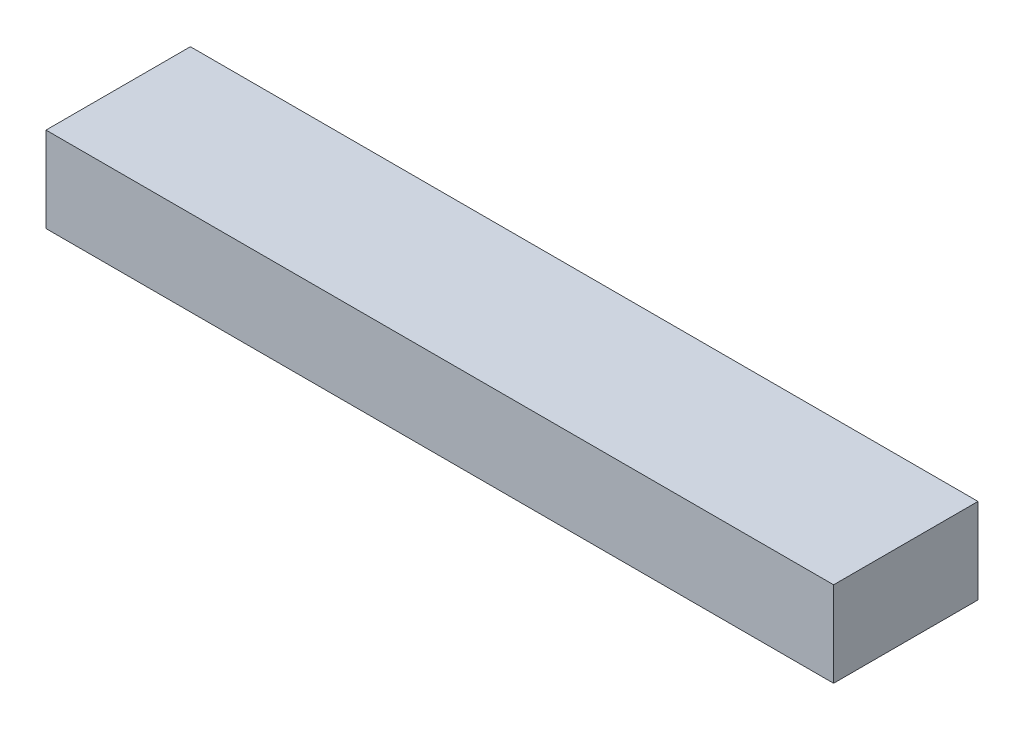
ISO-10303-21;
HEADER;
FILE_DESCRIPTION(('STEP AP214'),'2;1');
FILE_NAME('part.step','',(''),(''),'','','');
FILE_SCHEMA(('AUTOMOTIVE_DESIGN { 1 0 10303 214 1 1 1 1 }'));
ENDSEC;
DATA;
#1=APPLICATION_CONTEXT('core data for automotive mechanical design processes');
#2=APPLICATION_PROTOCOL_DEFINITION('international standard','automotive_design',2000,#1);
#3=PRODUCT_CONTEXT('',#1,'mechanical');
#4=PRODUCT('Part','Part','',(#3));
#5=PRODUCT_RELATED_PRODUCT_CATEGORY('part','',(#4));
#6=PRODUCT_DEFINITION_FORMATION('','',#4);
#7=PRODUCT_DEFINITION_CONTEXT('part definition',#1,'design');
#8=PRODUCT_DEFINITION('design','',#6,#7);
#9=PRODUCT_DEFINITION_SHAPE('','',#8);
#10=(LENGTH_UNIT() NAMED_UNIT(*) SI_UNIT(.MILLI.,.METRE.));
#11=(NAMED_UNIT(*) PLANE_ANGLE_UNIT() SI_UNIT($,.RADIAN.));
#12=(NAMED_UNIT(*) SI_UNIT($,.STERADIAN.) SOLID_ANGLE_UNIT());
#13=UNCERTAINTY_MEASURE_WITH_UNIT(LENGTH_MEASURE(1.E-05),#10,'distance_accuracy_value','');
#14=(GEOMETRIC_REPRESENTATION_CONTEXT(3) GLOBAL_UNCERTAINTY_ASSIGNED_CONTEXT((#13)) GLOBAL_UNIT_ASSIGNED_CONTEXT((#10,
#11,#12)) REPRESENTATION_CONTEXT('',''));
#15=CARTESIAN_POINT('',(0.,0.,0.));
#16=DIRECTION('',(0.,0.,1.));
#17=DIRECTION('',(1.,0.,0.));
#18=AXIS2_PLACEMENT_3D('',#15,#16,#17);
#19=CARTESIAN_POINT('',(-58.0824742268041,13.,-33.1134020618557));
#20=DIRECTION('',(1.,0.,0.));
#21=DIRECTION('',(0.,0.,-1.));
#22=AXIS2_PLACEMENT_3D('',#19,#20,#21);
#23=PLANE('',#22);
#24=DIRECTION('',(0.,0.,1.));
#25=VECTOR('',#24,1.);
#26=CARTESIAN_POINT('',(-58.0824742268041,0.,-33.1134020618557));
#27=LINE('',#26,#25);
#28=CARTESIAN_POINT('',(-58.0824742268041,0.,-33.1134020618557));
#29=VERTEX_POINT('',#28);
#30=CARTESIAN_POINT('',(-58.0824742268041,0.,-11.1134020618557));
#31=VERTEX_POINT('',#30);
#32=EDGE_CURVE('E97',#29,#31,#27,.T.);
#33=ORIENTED_EDGE('',*,*,#32,.T.);
#34=DIRECTION('',(0.,-1.,0.));
#35=VECTOR('',#34,1.);
#36=CARTESIAN_POINT('',(-58.0824742268041,13.,-11.1134020618557));
#37=LINE('',#36,#35);
#38=CARTESIAN_POINT('',(-58.0824742268041,13.,-11.1134020618557));
#39=VERTEX_POINT('',#38);
#40=EDGE_CURVE('E11',#39,#31,#37,.T.);
#41=ORIENTED_EDGE('',*,*,#40,.F.);
#42=DIRECTION('',(0.,0.,1.));
#43=VECTOR('',#42,1.);
#44=CARTESIAN_POINT('',(-58.0824742268041,13.,-33.1134020618557));
#45=LINE('',#44,#43);
#46=CARTESIAN_POINT('',(-58.0824742268041,13.,-33.1134020618557));
#47=VERTEX_POINT('',#46);
#48=EDGE_CURVE('E83',#47,#39,#45,.T.);
#49=ORIENTED_EDGE('',*,*,#48,.F.);
#50=DIRECTION('',(0.,-1.,0.));
#51=VECTOR('',#50,1.);
#52=CARTESIAN_POINT('',(-58.0824742268041,13.,-33.1134020618557));
#53=LINE('',#52,#51);
#54=EDGE_CURVE('E50',#47,#29,#53,.T.);
#55=ORIENTED_EDGE('',*,*,#54,.T.);
#56=EDGE_LOOP('',(#33,#41,#49,#55));
#57=FACE_BOUND('',#56,.T.);
#58=ADVANCED_FACE('F34',(#57),#23,.F.);
#59=CARTESIAN_POINT('',(-58.0824742268041,13.,-11.1134020618557));
#60=DIRECTION('',(0.,0.,-1.));
#61=DIRECTION('',(-1.,0.,0.));
#62=AXIS2_PLACEMENT_3D('',#59,#60,#61);
#63=PLANE('',#62);
#64=DIRECTION('',(1.,0.,0.));
#65=VECTOR('',#64,1.);
#66=CARTESIAN_POINT('',(-58.0824742268041,0.,-11.1134020618557));
#67=LINE('',#66,#65);
#68=CARTESIAN_POINT('',(61.9175257731959,0.,-11.1134020618557));
#69=VERTEX_POINT('',#68);
#70=EDGE_CURVE('E88',#31,#69,#67,.T.);
#71=ORIENTED_EDGE('',*,*,#70,.T.);
#72=DIRECTION('',(0.,-1.,0.));
#73=VECTOR('',#72,1.);
#74=CARTESIAN_POINT('',(61.9175257731959,13.,-11.1134020618557));
#75=LINE('',#74,#73);
#76=CARTESIAN_POINT('',(61.9175257731959,13.,-11.1134020618557));
#77=VERTEX_POINT('',#76);
#78=EDGE_CURVE('E42',#77,#69,#75,.T.);
#79=ORIENTED_EDGE('',*,*,#78,.F.);
#80=DIRECTION('',(1.,0.,0.));
#81=VECTOR('',#80,1.);
#82=CARTESIAN_POINT('',(-58.0824742268041,13.,-11.1134020618557));
#83=LINE('',#82,#81);
#84=EDGE_CURVE('E75',#39,#77,#83,.T.);
#85=ORIENTED_EDGE('',*,*,#84,.F.);
#86=ORIENTED_EDGE('',*,*,#40,.T.);
#87=EDGE_LOOP('',(#71,#79,#85,#86));
#88=FACE_BOUND('',#87,.T.);
#89=ADVANCED_FACE('F87',(#88),#63,.F.);
#90=CARTESIAN_POINT('',(61.9175257731959,13.,-33.1134020618557));
#91=DIRECTION('',(1.,0.,0.));
#92=DIRECTION('',(0.,0.,-1.));
#93=AXIS2_PLACEMENT_3D('',#90,#91,#92);
#94=PLANE('',#93);
#95=DIRECTION('',(0.,0.,1.));
#96=VECTOR('',#95,1.);
#97=CARTESIAN_POINT('',(61.9175257731959,0.,-33.1134020618557));
#98=LINE('',#97,#96);
#99=CARTESIAN_POINT('',(61.9175257731959,0.,-33.1134020618557));
#100=VERTEX_POINT('',#99);
#101=EDGE_CURVE('E100',#100,#69,#98,.T.);
#102=ORIENTED_EDGE('',*,*,#101,.F.);
#103=DIRECTION('',(0.,-1.,0.));
#104=VECTOR('',#103,1.);
#105=CARTESIAN_POINT('',(61.9175257731959,13.,-33.1134020618557));
#106=LINE('',#105,#104);
#107=CARTESIAN_POINT('',(61.9175257731959,13.,-33.1134020618557));
#108=VERTEX_POINT('',#107);
#109=EDGE_CURVE('E64',#108,#100,#106,.T.);
#110=ORIENTED_EDGE('',*,*,#109,.F.);
#111=DIRECTION('',(0.,0.,1.));
#112=VECTOR('',#111,1.);
#113=CARTESIAN_POINT('',(61.9175257731959,13.,-33.1134020618557));
#114=LINE('',#113,#112);
#115=EDGE_CURVE('E82',#108,#77,#114,.T.);
#116=ORIENTED_EDGE('',*,*,#115,.T.);
#117=ORIENTED_EDGE('',*,*,#78,.T.);
#118=EDGE_LOOP('',(#102,#110,#116,#117));
#119=FACE_BOUND('',#118,.T.);
#120=ADVANCED_FACE('F91',(#119),#94,.T.);
#121=CARTESIAN_POINT('',(-58.0824742268041,13.,-33.1134020618557));
#122=DIRECTION('',(0.,0.,-1.));
#123=DIRECTION('',(-1.,0.,0.));
#124=AXIS2_PLACEMENT_3D('',#121,#122,#123);
#125=PLANE('',#124);
#126=DIRECTION('',(1.,0.,0.));
#127=VECTOR('',#126,1.);
#128=CARTESIAN_POINT('',(-58.0824742268041,0.,-33.1134020618557));
#129=LINE('',#128,#127);
#130=EDGE_CURVE('E102',#29,#100,#129,.T.);
#131=ORIENTED_EDGE('',*,*,#130,.F.);
#132=ORIENTED_EDGE('',*,*,#54,.F.);
#133=DIRECTION('',(1.,0.,0.));
#134=VECTOR('',#133,1.);
#135=CARTESIAN_POINT('',(-58.0824742268041,13.,-33.1134020618557));
#136=LINE('',#135,#134);
#137=EDGE_CURVE('E92',#47,#108,#136,.T.);
#138=ORIENTED_EDGE('',*,*,#137,.T.);
#139=ORIENTED_EDGE('',*,*,#109,.T.);
#140=EDGE_LOOP('',(#131,#132,#138,#139));
#141=FACE_BOUND('',#140,.T.);
#142=ADVANCED_FACE('F108',(#141),#125,.T.);
#143=CARTESIAN_POINT('',(0.,13.,0.));
#144=DIRECTION('',(0.,1.,0.));
#145=DIRECTION('',(0.,0.,1.));
#146=AXIS2_PLACEMENT_3D('',#143,#144,#145);
#147=PLANE('',#146);
#148=ORIENTED_EDGE('',*,*,#48,.T.);
#149=ORIENTED_EDGE('',*,*,#84,.T.);
#150=ORIENTED_EDGE('',*,*,#115,.F.);
#151=ORIENTED_EDGE('',*,*,#137,.F.);
#152=EDGE_LOOP('',(#148,#149,#150,#151));
#153=FACE_BOUND('',#152,.T.);
#154=ADVANCED_FACE('F79',(#153),#147,.T.);
#155=CARTESIAN_POINT('',(0.,0.,0.));
#156=DIRECTION('',(0.,1.,0.));
#157=DIRECTION('',(0.,0.,1.));
#158=AXIS2_PLACEMENT_3D('',#155,#156,#157);
#159=PLANE('',#158);
#160=ORIENTED_EDGE('',*,*,#32,.F.);
#161=ORIENTED_EDGE('',*,*,#130,.T.);
#162=ORIENTED_EDGE('',*,*,#101,.T.);
#163=ORIENTED_EDGE('',*,*,#70,.F.);
#164=EDGE_LOOP('',(#160,#161,#162,#163));
#165=FACE_BOUND('',#164,.T.);
#166=ADVANCED_FACE('F107',(#165),#159,.F.);
#167=CLOSED_SHELL('',(#58,#89,#120,#142,#154,#166));
#168=MANIFOLD_SOLID_BREP('B2',#167);
#169=ADVANCED_BREP_SHAPE_REPRESENTATION('',(#18,#168),#14);
#170=SHAPE_DEFINITION_REPRESENTATION(#9,#169);
ENDSEC;
END-ISO-10303-21;
